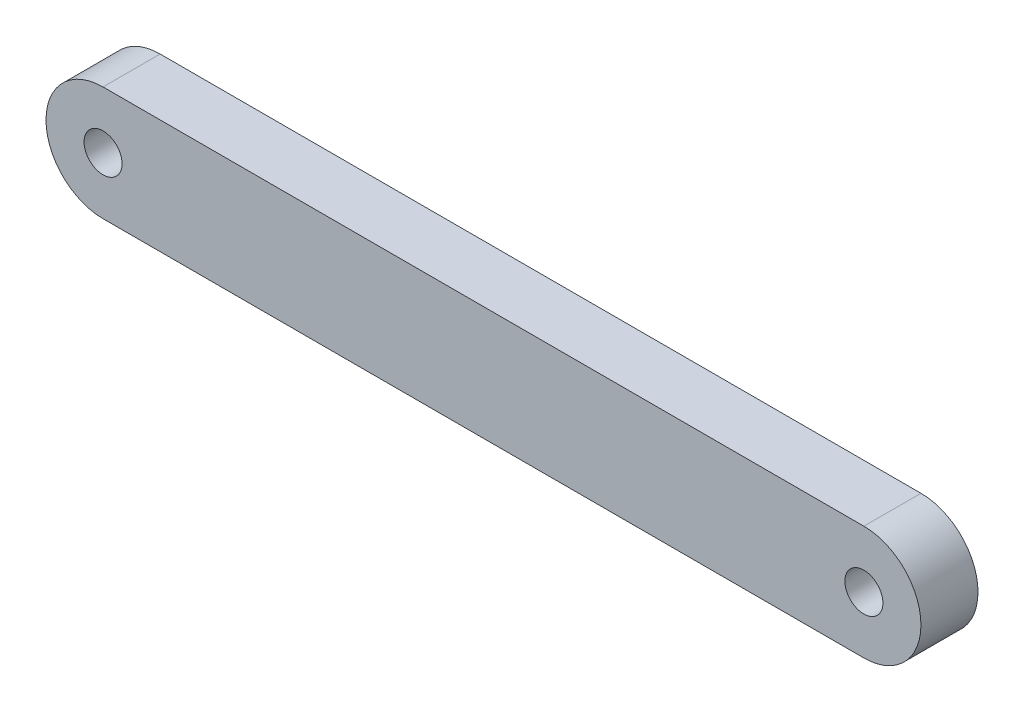
ISO-10303-21;
HEADER;
FILE_DESCRIPTION(('STEP AP214'),'2;1');
FILE_NAME('part.step','',(''),(''),'','','');
FILE_SCHEMA(('AUTOMOTIVE_DESIGN { 1 0 10303 214 1 1 1 1 }'));
ENDSEC;
DATA;
#1=APPLICATION_CONTEXT('core data for automotive mechanical design processes');
#2=APPLICATION_PROTOCOL_DEFINITION('international standard','automotive_design',2000,#1);
#3=PRODUCT_CONTEXT('',#1,'mechanical');
#4=PRODUCT('Part','Part','',(#3));
#5=PRODUCT_RELATED_PRODUCT_CATEGORY('part','',(#4));
#6=PRODUCT_DEFINITION_FORMATION('','',#4);
#7=PRODUCT_DEFINITION_CONTEXT('part definition',#1,'design');
#8=PRODUCT_DEFINITION('design','',#6,#7);
#9=PRODUCT_DEFINITION_SHAPE('','',#8);
#10=(LENGTH_UNIT() NAMED_UNIT(*) SI_UNIT(.MILLI.,.METRE.));
#11=(NAMED_UNIT(*) PLANE_ANGLE_UNIT() SI_UNIT($,.RADIAN.));
#12=(NAMED_UNIT(*) SI_UNIT($,.STERADIAN.) SOLID_ANGLE_UNIT());
#13=UNCERTAINTY_MEASURE_WITH_UNIT(LENGTH_MEASURE(1.E-05),#10,'distance_accuracy_value','');
#14=(GEOMETRIC_REPRESENTATION_CONTEXT(3) GLOBAL_UNCERTAINTY_ASSIGNED_CONTEXT((#13)) GLOBAL_UNIT_ASSIGNED_CONTEXT((#10,
#11,#12)) REPRESENTATION_CONTEXT('',''));
#15=CARTESIAN_POINT('',(0.,0.,0.));
#16=DIRECTION('',(0.,0.,1.));
#17=DIRECTION('',(1.,0.,0.));
#18=AXIS2_PLACEMENT_3D('',#15,#16,#17);
#19=CARTESIAN_POINT('',(20.,0.,3.));
#20=DIRECTION('',(0.,0.,1.));
#21=DIRECTION('',(1.,0.,0.));
#22=AXIS2_PLACEMENT_3D('',#19,#20,#21);
#23=PLANE('',#22);
#24=CARTESIAN_POINT('',(-20.,0.,3.));
#25=DIRECTION('',(0.,0.,1.));
#26=DIRECTION('',(1.,0.,0.));
#27=AXIS2_PLACEMENT_3D('',#24,#25,#26);
#28=CIRCLE('',#27,1.);
#29=CARTESIAN_POINT('',(-19.,0.,3.));
#30=VERTEX_POINT('',#29);
#31=EDGE_CURVE('E108',#30,#30,#28,.T.);
#32=ORIENTED_EDGE('',*,*,#31,.F.);
#33=EDGE_LOOP('',(#32));
#34=FACE_BOUND('',#33,.T.);
#35=CARTESIAN_POINT('',(20.,0.,3.));
#36=DIRECTION('',(0.,0.,1.));
#37=DIRECTION('',(1.,0.,0.));
#38=AXIS2_PLACEMENT_3D('',#35,#36,#37);
#39=CIRCLE('',#38,3.);
#40=CARTESIAN_POINT('',(20.,-3.,3.));
#41=VERTEX_POINT('',#40);
#42=CARTESIAN_POINT('',(20.,3.,3.));
#43=VERTEX_POINT('',#42);
#44=EDGE_CURVE('E93',#41,#43,#39,.T.);
#45=ORIENTED_EDGE('',*,*,#44,.T.);
#46=DIRECTION('',(-1.,0.,0.));
#47=VECTOR('',#46,1.);
#48=CARTESIAN_POINT('',(20.,3.,3.));
#49=LINE('',#48,#47);
#50=CARTESIAN_POINT('',(-20.,2.99999999999999,3.));
#51=VERTEX_POINT('',#50);
#52=EDGE_CURVE('E88',#43,#51,#49,.T.);
#53=ORIENTED_EDGE('',*,*,#52,.T.);
#54=CARTESIAN_POINT('',(-20.,0.,3.));
#55=DIRECTION('',(0.,0.,1.));
#56=DIRECTION('',(1.,0.,0.));
#57=AXIS2_PLACEMENT_3D('',#54,#55,#56);
#58=CIRCLE('',#57,3.);
#59=CARTESIAN_POINT('',(-20.,-3.00000000000001,3.));
#60=VERTEX_POINT('',#59);
#61=EDGE_CURVE('E91',#51,#60,#58,.T.);
#62=ORIENTED_EDGE('',*,*,#61,.T.);
#63=DIRECTION('',(1.,0.,0.));
#64=VECTOR('',#63,1.);
#65=CARTESIAN_POINT('',(20.,-3.,3.));
#66=LINE('',#65,#64);
#67=EDGE_CURVE('E58',#60,#41,#66,.T.);
#68=ORIENTED_EDGE('',*,*,#67,.T.);
#69=EDGE_LOOP('',(#45,#53,#62,#68));
#70=FACE_BOUND('',#69,.T.);
#71=CARTESIAN_POINT('',(20.,0.,3.));
#72=DIRECTION('',(0.,0.,1.));
#73=DIRECTION('',(1.,0.,0.));
#74=AXIS2_PLACEMENT_3D('',#71,#72,#73);
#75=CIRCLE('',#74,1.);
#76=CARTESIAN_POINT('',(21.,0.,3.));
#77=VERTEX_POINT('',#76);
#78=EDGE_CURVE('E123',#77,#77,#75,.T.);
#79=ORIENTED_EDGE('',*,*,#78,.F.);
#80=EDGE_LOOP('',(#79));
#81=FACE_BOUND('',#80,.T.);
#82=ADVANCED_FACE('F41',(#34,#70,#81),#23,.T.);
#83=CARTESIAN_POINT('',(20.,0.,0.));
#84=DIRECTION('',(0.,0.,1.));
#85=DIRECTION('',(1.,0.,0.));
#86=AXIS2_PLACEMENT_3D('',#83,#84,#85);
#87=PLANE('',#86);
#88=CARTESIAN_POINT('',(20.,0.,0.));
#89=DIRECTION('',(0.,0.,1.));
#90=DIRECTION('',(1.,0.,0.));
#91=AXIS2_PLACEMENT_3D('',#88,#89,#90);
#92=CIRCLE('',#91,3.);
#93=CARTESIAN_POINT('',(20.,-3.,0.));
#94=VERTEX_POINT('',#93);
#95=CARTESIAN_POINT('',(20.,3.,0.));
#96=VERTEX_POINT('',#95);
#97=EDGE_CURVE('E105',#94,#96,#92,.T.);
#98=ORIENTED_EDGE('',*,*,#97,.F.);
#99=DIRECTION('',(1.,0.,0.));
#100=VECTOR('',#99,1.);
#101=CARTESIAN_POINT('',(20.,-3.,0.));
#102=LINE('',#101,#100);
#103=CARTESIAN_POINT('',(-20.,-3.00000000000001,0.));
#104=VERTEX_POINT('',#103);
#105=EDGE_CURVE('E81',#104,#94,#102,.T.);
#106=ORIENTED_EDGE('',*,*,#105,.F.);
#107=CARTESIAN_POINT('',(-20.,0.,0.));
#108=DIRECTION('',(0.,0.,1.));
#109=DIRECTION('',(1.,0.,0.));
#110=AXIS2_PLACEMENT_3D('',#107,#108,#109);
#111=CIRCLE('',#110,3.);
#112=CARTESIAN_POINT('',(-20.,2.99999999999999,0.));
#113=VERTEX_POINT('',#112);
#114=EDGE_CURVE('E75',#113,#104,#111,.T.);
#115=ORIENTED_EDGE('',*,*,#114,.F.);
#116=DIRECTION('',(-1.,0.,0.));
#117=VECTOR('',#116,1.);
#118=CARTESIAN_POINT('',(20.,3.,0.));
#119=LINE('',#118,#117);
#120=EDGE_CURVE('E97',#96,#113,#119,.T.);
#121=ORIENTED_EDGE('',*,*,#120,.F.);
#122=EDGE_LOOP('',(#98,#106,#115,#121));
#123=FACE_BOUND('',#122,.T.);
#124=CARTESIAN_POINT('',(-20.,0.,0.));
#125=DIRECTION('',(0.,0.,1.));
#126=DIRECTION('',(1.,0.,0.));
#127=AXIS2_PLACEMENT_3D('',#124,#125,#126);
#128=CIRCLE('',#127,1.);
#129=CARTESIAN_POINT('',(-19.,0.,0.));
#130=VERTEX_POINT('',#129);
#131=EDGE_CURVE('E120',#130,#130,#128,.T.);
#132=ORIENTED_EDGE('',*,*,#131,.T.);
#133=EDGE_LOOP('',(#132));
#134=FACE_BOUND('',#133,.T.);
#135=CARTESIAN_POINT('',(20.,0.,0.));
#136=DIRECTION('',(0.,0.,1.));
#137=DIRECTION('',(1.,0.,0.));
#138=AXIS2_PLACEMENT_3D('',#135,#136,#137);
#139=CIRCLE('',#138,1.);
#140=CARTESIAN_POINT('',(21.,0.,0.));
#141=VERTEX_POINT('',#140);
#142=EDGE_CURVE('E126',#141,#141,#139,.T.);
#143=ORIENTED_EDGE('',*,*,#142,.T.);
#144=EDGE_LOOP('',(#143));
#145=FACE_BOUND('',#144,.T.);
#146=ADVANCED_FACE('F116',(#123,#134,#145),#87,.F.);
#147=CARTESIAN_POINT('',(20.,0.,3.));
#148=DIRECTION('',(0.,0.,-1.));
#149=DIRECTION('',(-1.,0.,0.));
#150=AXIS2_PLACEMENT_3D('',#147,#148,#149);
#151=CYLINDRICAL_SURFACE('',#150,3.);
#152=ORIENTED_EDGE('',*,*,#97,.T.);
#153=DIRECTION('',(0.,0.,-1.));
#154=VECTOR('',#153,1.);
#155=CARTESIAN_POINT('',(20.,3.,3.));
#156=LINE('',#155,#154);
#157=EDGE_CURVE('E11',#43,#96,#156,.T.);
#158=ORIENTED_EDGE('',*,*,#157,.F.);
#159=ORIENTED_EDGE('',*,*,#44,.F.);
#160=DIRECTION('',(0.,0.,-1.));
#161=VECTOR('',#160,1.);
#162=CARTESIAN_POINT('',(20.,-3.,3.));
#163=LINE('',#162,#161);
#164=EDGE_CURVE('E101',#41,#94,#163,.T.);
#165=ORIENTED_EDGE('',*,*,#164,.T.);
#166=EDGE_LOOP('',(#152,#158,#159,#165));
#167=FACE_BOUND('',#166,.T.);
#168=ADVANCED_FACE('F43',(#167),#151,.T.);
#169=CARTESIAN_POINT('',(20.,3.,3.));
#170=DIRECTION('',(0.,-1.,0.));
#171=DIRECTION('',(1.,0.,0.));
#172=AXIS2_PLACEMENT_3D('',#169,#170,#171);
#173=PLANE('',#172);
#174=ORIENTED_EDGE('',*,*,#120,.T.);
#175=DIRECTION('',(0.,0.,-1.));
#176=VECTOR('',#175,1.);
#177=CARTESIAN_POINT('',(-20.,2.99999999999999,3.));
#178=LINE('',#177,#176);
#179=EDGE_CURVE('E50',#51,#113,#178,.T.);
#180=ORIENTED_EDGE('',*,*,#179,.F.);
#181=ORIENTED_EDGE('',*,*,#52,.F.);
#182=ORIENTED_EDGE('',*,*,#157,.T.);
#183=EDGE_LOOP('',(#174,#180,#181,#182));
#184=FACE_BOUND('',#183,.T.);
#185=ADVANCED_FACE('F96',(#184),#173,.F.);
#186=CARTESIAN_POINT('',(-20.,0.,3.));
#187=DIRECTION('',(0.,0.,-1.));
#188=DIRECTION('',(-1.,0.,0.));
#189=AXIS2_PLACEMENT_3D('',#186,#187,#188);
#190=CYLINDRICAL_SURFACE('',#189,3.);
#191=ORIENTED_EDGE('',*,*,#114,.T.);
#192=DIRECTION('',(0.,0.,-1.));
#193=VECTOR('',#192,1.);
#194=CARTESIAN_POINT('',(-20.,-3.00000000000001,3.));
#195=LINE('',#194,#193);
#196=EDGE_CURVE('E98',#60,#104,#195,.T.);
#197=ORIENTED_EDGE('',*,*,#196,.F.);
#198=ORIENTED_EDGE('',*,*,#61,.F.);
#199=ORIENTED_EDGE('',*,*,#179,.T.);
#200=EDGE_LOOP('',(#191,#197,#198,#199));
#201=FACE_BOUND('',#200,.T.);
#202=ADVANCED_FACE('F99',(#201),#190,.T.);
#203=CARTESIAN_POINT('',(20.,-3.,3.));
#204=DIRECTION('',(0.,1.,0.));
#205=DIRECTION('',(-1.,0.,0.));
#206=AXIS2_PLACEMENT_3D('',#203,#204,#205);
#207=PLANE('',#206);
#208=ORIENTED_EDGE('',*,*,#105,.T.);
#209=ORIENTED_EDGE('',*,*,#164,.F.);
#210=ORIENTED_EDGE('',*,*,#67,.F.);
#211=ORIENTED_EDGE('',*,*,#196,.T.);
#212=EDGE_LOOP('',(#208,#209,#210,#211));
#213=FACE_BOUND('',#212,.T.);
#214=ADVANCED_FACE('F113',(#213),#207,.F.);
#215=CARTESIAN_POINT('',(-20.,0.,3.));
#216=DIRECTION('',(0.,0.,-1.));
#217=DIRECTION('',(-1.,0.,0.));
#218=AXIS2_PLACEMENT_3D('',#215,#216,#217);
#219=CYLINDRICAL_SURFACE('',#218,1.);
#220=ORIENTED_EDGE('',*,*,#31,.T.);
#221=EDGE_LOOP('',(#220));
#222=FACE_BOUND('',#221,.T.);
#223=ORIENTED_EDGE('',*,*,#131,.F.);
#224=EDGE_LOOP('',(#223));
#225=FACE_BOUND('',#224,.T.);
#226=ADVANCED_FACE('F143',(#222,#225),#219,.F.);
#227=CARTESIAN_POINT('',(20.,0.,3.));
#228=DIRECTION('',(0.,0.,-1.));
#229=DIRECTION('',(-1.,0.,0.));
#230=AXIS2_PLACEMENT_3D('',#227,#228,#229);
#231=CYLINDRICAL_SURFACE('',#230,1.);
#232=ORIENTED_EDGE('',*,*,#78,.T.);
#233=EDGE_LOOP('',(#232));
#234=FACE_BOUND('',#233,.T.);
#235=ORIENTED_EDGE('',*,*,#142,.F.);
#236=EDGE_LOOP('',(#235));
#237=FACE_BOUND('',#236,.T.);
#238=ADVANCED_FACE('F132',(#234,#237),#231,.F.);
#239=CLOSED_SHELL('',(#82,#146,#168,#185,#202,#214,#226,#238));
#240=MANIFOLD_SOLID_BREP('B2',#239);
#241=ADVANCED_BREP_SHAPE_REPRESENTATION('',(#18,#240),#14);
#242=SHAPE_DEFINITION_REPRESENTATION(#9,#241);
ENDSEC;
END-ISO-10303-21;
